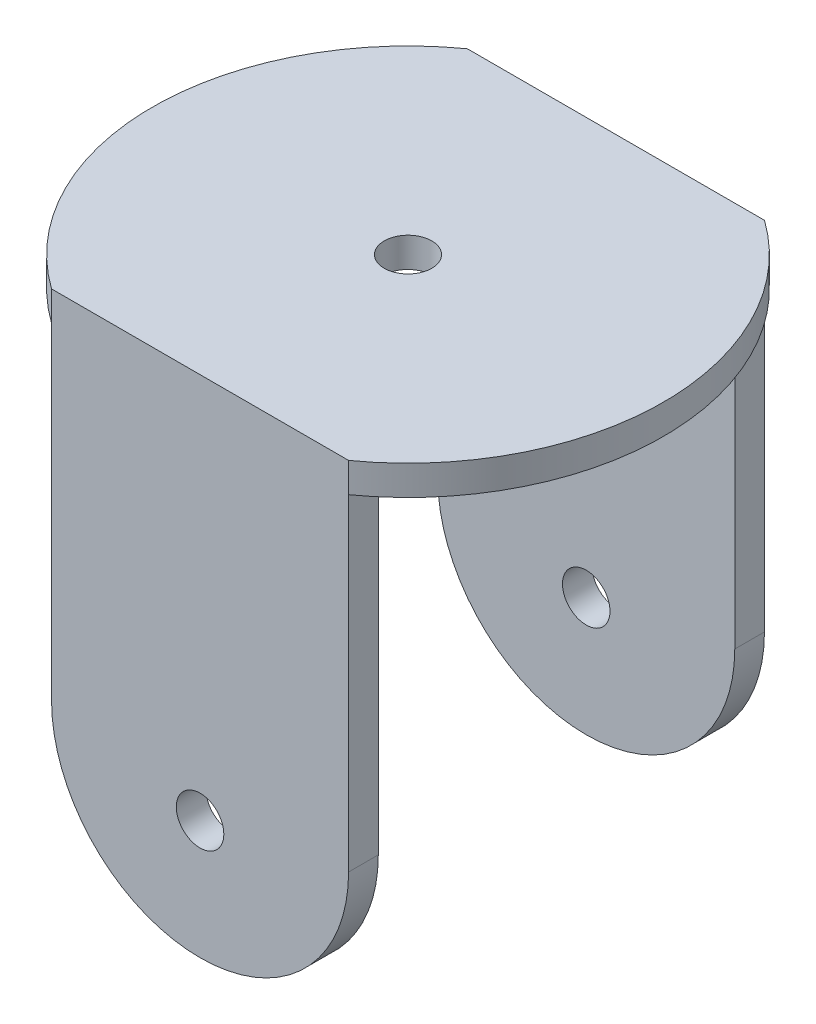
ISO-10303-21;
HEADER;
FILE_DESCRIPTION(('STEP AP214'),'2;1');
FILE_NAME('part.step','',(''),(''),'','','');
FILE_SCHEMA(('AUTOMOTIVE_DESIGN { 1 0 10303 214 1 1 1 1 }'));
ENDSEC;
DATA;
#1=APPLICATION_CONTEXT('core data for automotive mechanical design processes');
#2=APPLICATION_PROTOCOL_DEFINITION('international standard','automotive_design',2000,#1);
#3=PRODUCT_CONTEXT('',#1,'mechanical');
#4=PRODUCT('Part','Part','',(#3));
#5=PRODUCT_RELATED_PRODUCT_CATEGORY('part','',(#4));
#6=PRODUCT_DEFINITION_FORMATION('','',#4);
#7=PRODUCT_DEFINITION_CONTEXT('part definition',#1,'design');
#8=PRODUCT_DEFINITION('design','',#6,#7);
#9=PRODUCT_DEFINITION_SHAPE('','',#8);
#10=(LENGTH_UNIT() NAMED_UNIT(*) SI_UNIT(.MILLI.,.METRE.));
#11=(NAMED_UNIT(*) PLANE_ANGLE_UNIT() SI_UNIT($,.RADIAN.));
#12=(NAMED_UNIT(*) SI_UNIT($,.STERADIAN.) SOLID_ANGLE_UNIT());
#13=UNCERTAINTY_MEASURE_WITH_UNIT(LENGTH_MEASURE(1.E-05),#10,'distance_accuracy_value','');
#14=(GEOMETRIC_REPRESENTATION_CONTEXT(3) GLOBAL_UNCERTAINTY_ASSIGNED_CONTEXT((#13)) GLOBAL_UNIT_ASSIGNED_CONTEXT((#10,
#11,#12)) REPRESENTATION_CONTEXT('',''));
#15=CARTESIAN_POINT('',(0.,0.,0.));
#16=DIRECTION('',(0.,0.,1.));
#17=DIRECTION('',(1.,0.,0.));
#18=AXIS2_PLACEMENT_3D('',#15,#16,#17);
#19=CARTESIAN_POINT('',(0.,40.,35.));
#20=DIRECTION('',(0.,1.,0.));
#21=DIRECTION('',(-1.,0.,0.));
#22=AXIS2_PLACEMENT_3D('',#19,#20,#21);
#23=PLANE('',#22);
#24=CARTESIAN_POINT('',(0.,40.,35.));
#25=DIRECTION('',(0.,1.,0.));
#26=DIRECTION('',(-1.,0.,0.));
#27=AXIS2_PLACEMENT_3D('',#24,#25,#26);
#28=CIRCLE('',#27,4.);
#29=CARTESIAN_POINT('',(-4.00000000000001,40.,35.));
#30=VERTEX_POINT('',#29);
#31=EDGE_CURVE('E257',#30,#30,#28,.T.);
#32=ORIENTED_EDGE('',*,*,#31,.T.);
#33=EDGE_LOOP('',(#32));
#34=FACE_BOUND('',#33,.T.);
#35=DIRECTION('',(0.,0.,-1.));
#36=VECTOR('',#35,1.);
#37=CARTESIAN_POINT('',(25.,40.,70.));
#38=LINE('',#37,#36);
#39=CARTESIAN_POINT('',(25.,40.,70.));
#40=VERTEX_POINT('',#39);
#41=CARTESIAN_POINT('',(25.,40.,65.));
#42=VERTEX_POINT('',#41);
#43=EDGE_CURVE('E146',#40,#42,#38,.T.);
#44=ORIENTED_EDGE('',*,*,#43,.T.);
#45=DIRECTION('',(-1.,0.,0.));
#46=VECTOR('',#45,1.);
#47=CARTESIAN_POINT('',(25.,40.,65.));
#48=LINE('',#47,#46);
#49=CARTESIAN_POINT('',(-25.,40.,65.));
#50=VERTEX_POINT('',#49);
#51=EDGE_CURVE('E144',#42,#50,#48,.T.);
#52=ORIENTED_EDGE('',*,*,#51,.T.);
#53=DIRECTION('',(0.,0.,-1.));
#54=VECTOR('',#53,1.);
#55=CARTESIAN_POINT('',(-25.,40.,70.));
#56=LINE('',#55,#54);
#57=CARTESIAN_POINT('',(-25.,40.,70.));
#58=VERTEX_POINT('',#57);
#59=EDGE_CURVE('E130',#58,#50,#56,.T.);
#60=ORIENTED_EDGE('',*,*,#59,.F.);
#61=CARTESIAN_POINT('',(0.,40.,35.));
#62=DIRECTION('',(0.,1.,0.));
#63=DIRECTION('',(-1.,0.,0.));
#64=AXIS2_PLACEMENT_3D('',#61,#62,#63);
#65=CIRCLE('',#64,43.0116263352131);
#66=CARTESIAN_POINT('',(-25.,40.,0.));
#67=VERTEX_POINT('',#66);
#68=EDGE_CURVE('E142',#67,#58,#65,.T.);
#69=ORIENTED_EDGE('',*,*,#68,.F.);
#70=DIRECTION('',(0.,0.,-1.));
#71=VECTOR('',#70,1.);
#72=CARTESIAN_POINT('',(-25.,40.,5.));
#73=LINE('',#72,#71);
#74=CARTESIAN_POINT('',(-25.,40.,5.));
#75=VERTEX_POINT('',#74);
#76=EDGE_CURVE('E197',#75,#67,#73,.T.);
#77=ORIENTED_EDGE('',*,*,#76,.F.);
#78=DIRECTION('',(-1.,0.,0.));
#79=VECTOR('',#78,1.);
#80=CARTESIAN_POINT('',(-25.,40.,5.));
#81=LINE('',#80,#79);
#82=CARTESIAN_POINT('',(25.,40.,5.));
#83=VERTEX_POINT('',#82);
#84=EDGE_CURVE('E189',#83,#75,#81,.T.);
#85=ORIENTED_EDGE('',*,*,#84,.F.);
#86=DIRECTION('',(0.,0.,-1.));
#87=VECTOR('',#86,1.);
#88=CARTESIAN_POINT('',(25.,40.,5.));
#89=LINE('',#88,#87);
#90=CARTESIAN_POINT('',(25.,40.,0.));
#91=VERTEX_POINT('',#90);
#92=EDGE_CURVE('E205',#83,#91,#89,.T.);
#93=ORIENTED_EDGE('',*,*,#92,.T.);
#94=CARTESIAN_POINT('',(0.,40.,35.));
#95=DIRECTION('',(0.,1.,0.));
#96=DIRECTION('',(-1.,0.,0.));
#97=AXIS2_PLACEMENT_3D('',#94,#95,#96);
#98=CIRCLE('',#97,43.0116263352131);
#99=EDGE_CURVE('E165',#40,#91,#98,.T.);
#100=ORIENTED_EDGE('',*,*,#99,.F.);
#101=EDGE_LOOP('',(#44,#52,#60,#69,#77,#85,#93,#100));
#102=FACE_BOUND('',#101,.T.);
#103=ADVANCED_FACE('F39',(#34,#102),#23,.F.);
#104=CARTESIAN_POINT('',(25.,40.,5.));
#105=DIRECTION('',(-1.,0.,0.));
#106=DIRECTION('',(0.,-1.,0.));
#107=AXIS2_PLACEMENT_3D('',#104,#105,#106);
#108=PLANE('',#107);
#109=DIRECTION('',(0.,1.,0.));
#110=VECTOR('',#109,1.);
#111=CARTESIAN_POINT('',(25.,40.,5.));
#112=LINE('',#111,#110);
#113=CARTESIAN_POINT('',(25.,-15.,5.));
#114=VERTEX_POINT('',#113);
#115=EDGE_CURVE('E186',#114,#83,#112,.T.);
#116=ORIENTED_EDGE('',*,*,#115,.F.);
#117=DIRECTION('',(0.,0.,-1.));
#118=VECTOR('',#117,1.);
#119=CARTESIAN_POINT('',(25.,-15.,5.));
#120=LINE('',#119,#118);
#121=CARTESIAN_POINT('',(25.,-15.,0.));
#122=VERTEX_POINT('',#121);
#123=EDGE_CURVE('E231',#114,#122,#120,.T.);
#124=ORIENTED_EDGE('',*,*,#123,.T.);
#125=DIRECTION('',(0.,1.,0.));
#126=VECTOR('',#125,1.);
#127=CARTESIAN_POINT('',(25.,40.,0.));
#128=LINE('',#127,#126);
#129=EDGE_CURVE('E157',#122,#91,#128,.T.);
#130=ORIENTED_EDGE('',*,*,#129,.T.);
#131=ORIENTED_EDGE('',*,*,#92,.F.);
#132=EDGE_LOOP('',(#116,#124,#130,#131));
#133=FACE_BOUND('',#132,.T.);
#134=ADVANCED_FACE('F308',(#133),#108,.F.);
#135=CARTESIAN_POINT('',(-25.,40.,5.));
#136=DIRECTION('',(1.,0.,0.));
#137=DIRECTION('',(0.,1.,0.));
#138=AXIS2_PLACEMENT_3D('',#135,#136,#137);
#139=PLANE('',#138);
#140=DIRECTION('',(0.,-1.,0.));
#141=VECTOR('',#140,1.);
#142=CARTESIAN_POINT('',(-25.,40.,0.));
#143=LINE('',#142,#141);
#144=CARTESIAN_POINT('',(-25.,-15.,0.));
#145=VERTEX_POINT('',#144);
#146=EDGE_CURVE('E190',#67,#145,#143,.T.);
#147=ORIENTED_EDGE('',*,*,#146,.T.);
#148=DIRECTION('',(0.,0.,-1.));
#149=VECTOR('',#148,1.);
#150=CARTESIAN_POINT('',(-25.,-15.,5.));
#151=LINE('',#150,#149);
#152=CARTESIAN_POINT('',(-25.,-15.,5.));
#153=VERTEX_POINT('',#152);
#154=EDGE_CURVE('E221',#145,#153,#151,.F.);
#155=ORIENTED_EDGE('',*,*,#154,.T.);
#156=DIRECTION('',(0.,-1.,0.));
#157=VECTOR('',#156,1.);
#158=CARTESIAN_POINT('',(-25.,40.,5.));
#159=LINE('',#158,#157);
#160=EDGE_CURVE('E193',#75,#153,#159,.T.);
#161=ORIENTED_EDGE('',*,*,#160,.F.);
#162=ORIENTED_EDGE('',*,*,#76,.T.);
#163=EDGE_LOOP('',(#147,#155,#161,#162));
#164=FACE_BOUND('',#163,.T.);
#165=ADVANCED_FACE('F295',(#164),#139,.F.);
#166=CARTESIAN_POINT('',(0.,0.,5.));
#167=DIRECTION('',(0.,0.,1.));
#168=DIRECTION('',(1.,0.,0.));
#169=AXIS2_PLACEMENT_3D('',#166,#167,#168);
#170=PLANE('',#169);
#171=CARTESIAN_POINT('',(0.,-20.,5.));
#172=DIRECTION('',(0.,0.,1.));
#173=DIRECTION('',(1.,0.,0.));
#174=AXIS2_PLACEMENT_3D('',#171,#172,#173);
#175=CIRCLE('',#174,4.);
#176=CARTESIAN_POINT('',(4.00000000000001,-20.,5.));
#177=VERTEX_POINT('',#176);
#178=EDGE_CURVE('E214',#177,#177,#175,.T.);
#179=ORIENTED_EDGE('',*,*,#178,.F.);
#180=EDGE_LOOP('',(#179));
#181=FACE_BOUND('',#180,.T.);
#182=ORIENTED_EDGE('',*,*,#160,.T.);
#183=CARTESIAN_POINT('',(0.,-15.,5.));
#184=DIRECTION('',(0.,0.,1.));
#185=DIRECTION('',(1.,0.,0.));
#186=AXIS2_PLACEMENT_3D('',#183,#184,#185);
#187=CIRCLE('',#186,25.);
#188=CARTESIAN_POINT('',(0.,-40.,5.));
#189=VERTEX_POINT('',#188);
#190=EDGE_CURVE('E228',#153,#189,#187,.T.);
#191=ORIENTED_EDGE('',*,*,#190,.T.);
#192=CARTESIAN_POINT('',(0.,-15.,5.));
#193=DIRECTION('',(0.,0.,1.));
#194=DIRECTION('',(1.,0.,0.));
#195=AXIS2_PLACEMENT_3D('',#192,#193,#194);
#196=CIRCLE('',#195,25.);
#197=EDGE_CURVE('E225',#189,#114,#196,.T.);
#198=ORIENTED_EDGE('',*,*,#197,.T.);
#199=ORIENTED_EDGE('',*,*,#115,.T.);
#200=ORIENTED_EDGE('',*,*,#84,.T.);
#201=EDGE_LOOP('',(#182,#191,#198,#199,#200));
#202=FACE_BOUND('',#201,.T.);
#203=ADVANCED_FACE('F300',(#181,#202),#170,.T.);
#204=CARTESIAN_POINT('',(0.,0.,0.));
#205=DIRECTION('',(0.,0.,1.));
#206=DIRECTION('',(1.,0.,0.));
#207=AXIS2_PLACEMENT_3D('',#204,#205,#206);
#208=PLANE('',#207);
#209=CARTESIAN_POINT('',(0.,-20.,0.));
#210=DIRECTION('',(0.,0.,1.));
#211=DIRECTION('',(1.,0.,0.));
#212=AXIS2_PLACEMENT_3D('',#209,#210,#211);
#213=CIRCLE('',#212,4.);
#214=CARTESIAN_POINT('',(4.00000000000001,-20.,0.));
#215=VERTEX_POINT('',#214);
#216=EDGE_CURVE('E215',#215,#215,#213,.T.);
#217=ORIENTED_EDGE('',*,*,#216,.T.);
#218=EDGE_LOOP('',(#217));
#219=FACE_BOUND('',#218,.T.);
#220=CARTESIAN_POINT('',(0.,-15.,0.));
#221=DIRECTION('',(0.,0.,1.));
#222=DIRECTION('',(1.,0.,0.));
#223=AXIS2_PLACEMENT_3D('',#220,#221,#222);
#224=CIRCLE('',#223,25.);
#225=CARTESIAN_POINT('',(0.,-40.,0.));
#226=VERTEX_POINT('',#225);
#227=EDGE_CURVE('E209',#122,#226,#224,.F.);
#228=ORIENTED_EDGE('',*,*,#227,.T.);
#229=CARTESIAN_POINT('',(0.,-15.,0.));
#230=DIRECTION('',(0.,0.,1.));
#231=DIRECTION('',(1.,0.,0.));
#232=AXIS2_PLACEMENT_3D('',#229,#230,#231);
#233=CIRCLE('',#232,25.);
#234=EDGE_CURVE('E218',#226,#145,#233,.F.);
#235=ORIENTED_EDGE('',*,*,#234,.T.);
#236=ORIENTED_EDGE('',*,*,#146,.F.);
#237=DIRECTION('',(0.,-1.,0.));
#238=VECTOR('',#237,1.);
#239=CARTESIAN_POINT('',(-25.,45.,0.));
#240=LINE('',#239,#238);
#241=CARTESIAN_POINT('',(-25.,45.,0.));
#242=VERTEX_POINT('',#241);
#243=EDGE_CURVE('E163',#242,#67,#240,.T.);
#244=ORIENTED_EDGE('',*,*,#243,.F.);
#245=DIRECTION('',(-1.,0.,0.));
#246=VECTOR('',#245,1.);
#247=CARTESIAN_POINT('',(-25.,45.,0.));
#248=LINE('',#247,#246);
#249=CARTESIAN_POINT('',(25.,45.,0.));
#250=VERTEX_POINT('',#249);
#251=EDGE_CURVE('E174',#250,#242,#248,.T.);
#252=ORIENTED_EDGE('',*,*,#251,.F.);
#253=DIRECTION('',(0.,-1.,0.));
#254=VECTOR('',#253,1.);
#255=CARTESIAN_POINT('',(25.,45.,0.));
#256=LINE('',#255,#254);
#257=EDGE_CURVE('E179',#250,#91,#256,.T.);
#258=ORIENTED_EDGE('',*,*,#257,.T.);
#259=ORIENTED_EDGE('',*,*,#129,.F.);
#260=EDGE_LOOP('',(#228,#235,#236,#244,#252,#258,#259));
#261=FACE_BOUND('',#260,.T.);
#262=ADVANCED_FACE('F292',(#219,#261),#208,.F.);
#263=CARTESIAN_POINT('',(0.,45.,35.));
#264=DIRECTION('',(0.,-1.,0.));
#265=DIRECTION('',(1.,0.,0.));
#266=AXIS2_PLACEMENT_3D('',#263,#264,#265);
#267=CYLINDRICAL_SURFACE('',#266,43.0116263352131);
#268=ORIENTED_EDGE('',*,*,#68,.T.);
#269=DIRECTION('',(0.,-1.,0.));
#270=VECTOR('',#269,1.);
#271=CARTESIAN_POINT('',(-25.,45.,70.));
#272=LINE('',#271,#270);
#273=CARTESIAN_POINT('',(-25.,45.,70.));
#274=VERTEX_POINT('',#273);
#275=EDGE_CURVE('E149',#274,#58,#272,.T.);
#276=ORIENTED_EDGE('',*,*,#275,.F.);
#277=CARTESIAN_POINT('',(0.,45.,35.));
#278=DIRECTION('',(0.,1.,0.));
#279=DIRECTION('',(-1.,0.,0.));
#280=AXIS2_PLACEMENT_3D('',#277,#278,#279);
#281=CIRCLE('',#280,43.0116263352131);
#282=EDGE_CURVE('E170',#242,#274,#281,.T.);
#283=ORIENTED_EDGE('',*,*,#282,.F.);
#284=ORIENTED_EDGE('',*,*,#243,.T.);
#285=EDGE_LOOP('',(#268,#276,#283,#284));
#286=FACE_BOUND('',#285,.T.);
#287=ADVANCED_FACE('F161',(#286),#267,.T.);
#288=CARTESIAN_POINT('',(-25.,45.,70.));
#289=DIRECTION('',(0.,0.,-1.));
#290=DIRECTION('',(-1.,0.,0.));
#291=AXIS2_PLACEMENT_3D('',#288,#289,#290);
#292=PLANE('',#291);
#293=CARTESIAN_POINT('',(0.,-20.,70.));
#294=DIRECTION('',(0.,0.,1.));
#295=DIRECTION('',(1.,0.,0.));
#296=AXIS2_PLACEMENT_3D('',#293,#294,#295);
#297=CIRCLE('',#296,4.);
#298=CARTESIAN_POINT('',(4.00000000000001,-20.,70.));
#299=VERTEX_POINT('',#298);
#300=EDGE_CURVE('E323',#299,#299,#297,.T.);
#301=ORIENTED_EDGE('',*,*,#300,.F.);
#302=EDGE_LOOP('',(#301));
#303=FACE_BOUND('',#302,.T.);
#304=CARTESIAN_POINT('',(0.,-15.,70.));
#305=DIRECTION('',(0.,0.,-1.));
#306=DIRECTION('',(-1.,0.,0.));
#307=AXIS2_PLACEMENT_3D('',#304,#305,#306);
#308=CIRCLE('',#307,25.);
#309=CARTESIAN_POINT('',(-25.,-15.,70.));
#310=VERTEX_POINT('',#309);
#311=CARTESIAN_POINT('',(0.,-40.,70.));
#312=VERTEX_POINT('',#311);
#313=EDGE_CURVE('E57',#310,#312,#308,.F.);
#314=ORIENTED_EDGE('',*,*,#313,.T.);
#315=CARTESIAN_POINT('',(0.,-15.,70.));
#316=DIRECTION('',(0.,0.,-1.));
#317=DIRECTION('',(-1.,0.,0.));
#318=AXIS2_PLACEMENT_3D('',#315,#316,#317);
#319=CIRCLE('',#318,25.);
#320=CARTESIAN_POINT('',(25.,-15.,70.));
#321=VERTEX_POINT('',#320);
#322=EDGE_CURVE('E49',#312,#321,#319,.F.);
#323=ORIENTED_EDGE('',*,*,#322,.T.);
#324=DIRECTION('',(0.,1.,0.));
#325=VECTOR('',#324,1.);
#326=CARTESIAN_POINT('',(25.,-40.,70.));
#327=LINE('',#326,#325);
#328=EDGE_CURVE('E134',#321,#40,#327,.T.);
#329=ORIENTED_EDGE('',*,*,#328,.T.);
#330=DIRECTION('',(0.,-1.,0.));
#331=VECTOR('',#330,1.);
#332=CARTESIAN_POINT('',(25.,45.,70.));
#333=LINE('',#332,#331);
#334=CARTESIAN_POINT('',(25.,45.,70.));
#335=VERTEX_POINT('',#334);
#336=EDGE_CURVE('E158',#335,#40,#333,.T.);
#337=ORIENTED_EDGE('',*,*,#336,.F.);
#338=DIRECTION('',(1.,0.,0.));
#339=VECTOR('',#338,1.);
#340=CARTESIAN_POINT('',(-25.,45.,70.));
#341=LINE('',#340,#339);
#342=EDGE_CURVE('E152',#274,#335,#341,.T.);
#343=ORIENTED_EDGE('',*,*,#342,.F.);
#344=ORIENTED_EDGE('',*,*,#275,.T.);
#345=DIRECTION('',(0.,-1.,0.));
#346=VECTOR('',#345,1.);
#347=CARTESIAN_POINT('',(-25.,40.,70.));
#348=LINE('',#347,#346);
#349=EDGE_CURVE('E127',#58,#310,#348,.T.);
#350=ORIENTED_EDGE('',*,*,#349,.T.);
#351=EDGE_LOOP('',(#314,#323,#329,#337,#343,#344,#350));
#352=FACE_BOUND('',#351,.T.);
#353=ADVANCED_FACE('F150',(#303,#352),#292,.F.);
#354=CARTESIAN_POINT('',(0.,45.,35.));
#355=DIRECTION('',(0.,-1.,0.));
#356=DIRECTION('',(1.,0.,0.));
#357=AXIS2_PLACEMENT_3D('',#354,#355,#356);
#358=CYLINDRICAL_SURFACE('',#357,43.0116263352131);
#359=ORIENTED_EDGE('',*,*,#99,.T.);
#360=ORIENTED_EDGE('',*,*,#257,.F.);
#361=CARTESIAN_POINT('',(0.,45.,35.));
#362=DIRECTION('',(0.,1.,0.));
#363=DIRECTION('',(-1.,0.,0.));
#364=AXIS2_PLACEMENT_3D('',#361,#362,#363);
#365=CIRCLE('',#364,43.0116263352131);
#366=EDGE_CURVE('E282',#335,#250,#365,.T.);
#367=ORIENTED_EDGE('',*,*,#366,.F.);
#368=ORIENTED_EDGE('',*,*,#336,.T.);
#369=EDGE_LOOP('',(#359,#360,#367,#368));
#370=FACE_BOUND('',#369,.T.);
#371=ADVANCED_FACE('F311',(#370),#358,.T.);
#372=CARTESIAN_POINT('',(0.,45.,35.));
#373=DIRECTION('',(0.,1.,0.));
#374=DIRECTION('',(-1.,0.,0.));
#375=AXIS2_PLACEMENT_3D('',#372,#373,#374);
#376=PLANE('',#375);
#377=CARTESIAN_POINT('',(0.,45.,35.));
#378=DIRECTION('',(0.,1.,0.));
#379=DIRECTION('',(-1.,0.,0.));
#380=AXIS2_PLACEMENT_3D('',#377,#378,#379);
#381=CIRCLE('',#380,4.);
#382=CARTESIAN_POINT('',(-4.00000000000001,45.,35.));
#383=VERTEX_POINT('',#382);
#384=EDGE_CURVE('E250',#383,#383,#381,.T.);
#385=ORIENTED_EDGE('',*,*,#384,.F.);
#386=EDGE_LOOP('',(#385));
#387=FACE_BOUND('',#386,.T.);
#388=ORIENTED_EDGE('',*,*,#282,.T.);
#389=ORIENTED_EDGE('',*,*,#342,.T.);
#390=ORIENTED_EDGE('',*,*,#366,.T.);
#391=ORIENTED_EDGE('',*,*,#251,.T.);
#392=EDGE_LOOP('',(#388,#389,#390,#391));
#393=FACE_BOUND('',#392,.T.);
#394=ADVANCED_FACE('F289',(#387,#393),#376,.T.);
#395=CARTESIAN_POINT('',(25.,-40.,70.));
#396=DIRECTION('',(-1.,0.,0.));
#397=DIRECTION('',(0.,-1.,0.));
#398=AXIS2_PLACEMENT_3D('',#395,#396,#397);
#399=PLANE('',#398);
#400=ORIENTED_EDGE('',*,*,#328,.F.);
#401=DIRECTION('',(0.,0.,-1.));
#402=VECTOR('',#401,1.);
#403=CARTESIAN_POINT('',(25.,-15.,70.));
#404=LINE('',#403,#402);
#405=CARTESIAN_POINT('',(25.,-15.,65.));
#406=VERTEX_POINT('',#405);
#407=EDGE_CURVE('E234',#321,#406,#404,.T.);
#408=ORIENTED_EDGE('',*,*,#407,.T.);
#409=DIRECTION('',(0.,1.,0.));
#410=VECTOR('',#409,1.);
#411=CARTESIAN_POINT('',(25.,-40.,65.));
#412=LINE('',#411,#410);
#413=EDGE_CURVE('E275',#406,#42,#412,.T.);
#414=ORIENTED_EDGE('',*,*,#413,.T.);
#415=ORIENTED_EDGE('',*,*,#43,.F.);
#416=EDGE_LOOP('',(#400,#408,#414,#415));
#417=FACE_BOUND('',#416,.T.);
#418=ADVANCED_FACE('F317',(#417),#399,.F.);
#419=CARTESIAN_POINT('',(-25.,40.,70.));
#420=DIRECTION('',(1.,0.,0.));
#421=DIRECTION('',(0.,1.,0.));
#422=AXIS2_PLACEMENT_3D('',#419,#420,#421);
#423=PLANE('',#422);
#424=DIRECTION('',(0.,-1.,0.));
#425=VECTOR('',#424,1.);
#426=CARTESIAN_POINT('',(-25.,40.,65.));
#427=LINE('',#426,#425);
#428=CARTESIAN_POINT('',(-25.,-15.,65.));
#429=VERTEX_POINT('',#428);
#430=EDGE_CURVE('E269',#50,#429,#427,.T.);
#431=ORIENTED_EDGE('',*,*,#430,.T.);
#432=DIRECTION('',(0.,0.,-1.));
#433=VECTOR('',#432,1.);
#434=CARTESIAN_POINT('',(-25.,-15.,70.));
#435=LINE('',#434,#433);
#436=EDGE_CURVE('E11',#429,#310,#435,.F.);
#437=ORIENTED_EDGE('',*,*,#436,.T.);
#438=ORIENTED_EDGE('',*,*,#349,.F.);
#439=ORIENTED_EDGE('',*,*,#59,.T.);
#440=EDGE_LOOP('',(#431,#437,#438,#439));
#441=FACE_BOUND('',#440,.T.);
#442=ADVANCED_FACE('F129',(#441),#423,.F.);
#443=CARTESIAN_POINT('',(0.,0.,65.));
#444=DIRECTION('',(0.,0.,1.));
#445=DIRECTION('',(1.,0.,0.));
#446=AXIS2_PLACEMENT_3D('',#443,#444,#445);
#447=PLANE('',#446);
#448=CARTESIAN_POINT('',(0.,-20.,65.));
#449=DIRECTION('',(0.,0.,1.));
#450=DIRECTION('',(1.,0.,0.));
#451=AXIS2_PLACEMENT_3D('',#448,#449,#450);
#452=CIRCLE('',#451,4.);
#453=CARTESIAN_POINT('',(4.00000000000001,-20.,65.));
#454=VERTEX_POINT('',#453);
#455=EDGE_CURVE('E210',#454,#454,#452,.T.);
#456=ORIENTED_EDGE('',*,*,#455,.T.);
#457=EDGE_LOOP('',(#456));
#458=FACE_BOUND('',#457,.T.);
#459=ORIENTED_EDGE('',*,*,#413,.F.);
#460=CARTESIAN_POINT('',(0.,-15.,65.));
#461=DIRECTION('',(0.,0.,1.));
#462=DIRECTION('',(1.,0.,0.));
#463=AXIS2_PLACEMENT_3D('',#460,#461,#462);
#464=CIRCLE('',#463,25.);
#465=CARTESIAN_POINT('',(0.,-40.,65.));
#466=VERTEX_POINT('',#465);
#467=EDGE_CURVE('E241',#406,#466,#464,.F.);
#468=ORIENTED_EDGE('',*,*,#467,.T.);
#469=CARTESIAN_POINT('',(0.,-15.,65.));
#470=DIRECTION('',(0.,0.,1.));
#471=DIRECTION('',(1.,0.,0.));
#472=AXIS2_PLACEMENT_3D('',#469,#470,#471);
#473=CIRCLE('',#472,25.);
#474=EDGE_CURVE('E238',#466,#429,#473,.F.);
#475=ORIENTED_EDGE('',*,*,#474,.T.);
#476=ORIENTED_EDGE('',*,*,#430,.F.);
#477=ORIENTED_EDGE('',*,*,#51,.F.);
#478=EDGE_LOOP('',(#459,#468,#475,#476,#477));
#479=FACE_BOUND('',#478,.T.);
#480=ADVANCED_FACE('F268',(#458,#479),#447,.F.);
#481=CARTESIAN_POINT('',(0.,-20.,0.));
#482=DIRECTION('',(0.,0.,1.));
#483=DIRECTION('',(1.,0.,0.));
#484=AXIS2_PLACEMENT_3D('',#481,#482,#483);
#485=CYLINDRICAL_SURFACE('',#484,4.);
#486=ORIENTED_EDGE('',*,*,#300,.T.);
#487=EDGE_LOOP('',(#486));
#488=FACE_BOUND('',#487,.T.);
#489=ORIENTED_EDGE('',*,*,#455,.F.);
#490=EDGE_LOOP('',(#489));
#491=FACE_BOUND('',#490,.T.);
#492=ADVANCED_FACE('F345',(#488,#491),#485,.F.);
#493=ORIENTED_EDGE('',*,*,#178,.T.);
#494=EDGE_LOOP('',(#493));
#495=FACE_BOUND('',#494,.T.);
#496=ORIENTED_EDGE('',*,*,#216,.F.);
#497=EDGE_LOOP('',(#496));
#498=FACE_BOUND('',#497,.T.);
#499=ADVANCED_FACE('F337',(#495,#498),#485,.F.);
#500=CARTESIAN_POINT('',(0.,-40.,35.));
#501=DIRECTION('',(0.,1.,0.));
#502=DIRECTION('',(-1.,0.,0.));
#503=AXIS2_PLACEMENT_3D('',#500,#501,#502);
#504=CYLINDRICAL_SURFACE('',#503,4.);
#505=ORIENTED_EDGE('',*,*,#384,.T.);
#506=EDGE_LOOP('',(#505));
#507=FACE_BOUND('',#506,.T.);
#508=ORIENTED_EDGE('',*,*,#31,.F.);
#509=EDGE_LOOP('',(#508));
#510=FACE_BOUND('',#509,.T.);
#511=ADVANCED_FACE('F335',(#507,#510),#504,.F.);
#512=CARTESIAN_POINT('',(0.,-15.,5.));
#513=DIRECTION('',(0.,0.,-1.));
#514=DIRECTION('',(-1.,0.,0.));
#515=AXIS2_PLACEMENT_3D('',#512,#513,#514);
#516=CYLINDRICAL_SURFACE('',#515,25.);
#517=ORIENTED_EDGE('',*,*,#123,.F.);
#518=ORIENTED_EDGE('',*,*,#197,.F.);
#519=DIRECTION('',(0.,0.,-1.));
#520=VECTOR('',#519,1.);
#521=CARTESIAN_POINT('',(0.,-40.,5.));
#522=LINE('',#521,#520);
#523=EDGE_CURVE('E247',#226,#189,#522,.F.);
#524=ORIENTED_EDGE('',*,*,#523,.F.);
#525=ORIENTED_EDGE('',*,*,#227,.F.);
#526=EDGE_LOOP('',(#517,#518,#524,#525));
#527=FACE_BOUND('',#526,.T.);
#528=ADVANCED_FACE('F304',(#527),#516,.T.);
#529=CARTESIAN_POINT('',(0.,-15.,5.));
#530=DIRECTION('',(0.,0.,-1.));
#531=DIRECTION('',(-1.,0.,0.));
#532=AXIS2_PLACEMENT_3D('',#529,#530,#531);
#533=CYLINDRICAL_SURFACE('',#532,25.);
#534=ORIENTED_EDGE('',*,*,#190,.F.);
#535=ORIENTED_EDGE('',*,*,#154,.F.);
#536=ORIENTED_EDGE('',*,*,#234,.F.);
#537=ORIENTED_EDGE('',*,*,#523,.T.);
#538=EDGE_LOOP('',(#534,#535,#536,#537));
#539=FACE_BOUND('',#538,.T.);
#540=ADVANCED_FACE('F297',(#539),#533,.T.);
#541=CARTESIAN_POINT('',(0.,-15.,70.));
#542=DIRECTION('',(0.,0.,-1.));
#543=DIRECTION('',(-1.,0.,0.));
#544=AXIS2_PLACEMENT_3D('',#541,#542,#543);
#545=CYLINDRICAL_SURFACE('',#544,25.);
#546=DIRECTION('',(0.,0.,-1.));
#547=VECTOR('',#546,1.);
#548=CARTESIAN_POINT('',(0.,-40.,70.));
#549=LINE('',#548,#547);
#550=EDGE_CURVE('E43',#312,#466,#549,.T.);
#551=ORIENTED_EDGE('',*,*,#550,.F.);
#552=ORIENTED_EDGE('',*,*,#313,.F.);
#553=ORIENTED_EDGE('',*,*,#436,.F.);
#554=ORIENTED_EDGE('',*,*,#474,.F.);
#555=EDGE_LOOP('',(#551,#552,#553,#554));
#556=FACE_BOUND('',#555,.T.);
#557=ADVANCED_FACE('F41',(#556),#545,.T.);
#558=CARTESIAN_POINT('',(0.,-15.,70.));
#559=DIRECTION('',(0.,0.,-1.));
#560=DIRECTION('',(-1.,0.,0.));
#561=AXIS2_PLACEMENT_3D('',#558,#559,#560);
#562=CYLINDRICAL_SURFACE('',#561,25.);
#563=ORIENTED_EDGE('',*,*,#322,.F.);
#564=ORIENTED_EDGE('',*,*,#550,.T.);
#565=ORIENTED_EDGE('',*,*,#467,.F.);
#566=ORIENTED_EDGE('',*,*,#407,.F.);
#567=EDGE_LOOP('',(#563,#564,#565,#566));
#568=FACE_BOUND('',#567,.T.);
#569=ADVANCED_FACE('F262',(#568),#562,.T.);
#570=CLOSED_SHELL('',(#103,#134,#165,#203,#262,#287,#353,#371,#394,#418,#442,#480,#492,#499,
#511,#528,#540,#557,#569));
#571=MANIFOLD_SOLID_BREP('B2',#570);
#572=ADVANCED_BREP_SHAPE_REPRESENTATION('',(#18,#571),#14);
#573=SHAPE_DEFINITION_REPRESENTATION(#9,#572);
ENDSEC;
END-ISO-10303-21;
